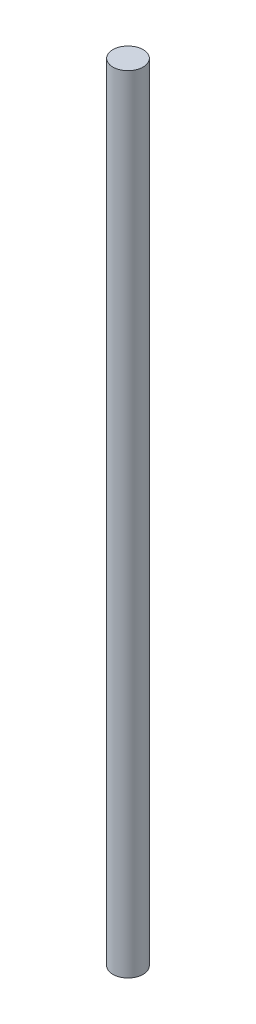
ISO-10303-21;
HEADER;
FILE_DESCRIPTION(('STEP AP214'),'2;1');
FILE_NAME('part.step','',(''),(''),'','','');
FILE_SCHEMA(('AUTOMOTIVE_DESIGN { 1 0 10303 214 1 1 1 1 }'));
ENDSEC;
DATA;
#1=APPLICATION_CONTEXT('core data for automotive mechanical design processes');
#2=APPLICATION_PROTOCOL_DEFINITION('international standard','automotive_design',2000,#1);
#3=PRODUCT_CONTEXT('',#1,'mechanical');
#4=PRODUCT('Part','Part','',(#3));
#5=PRODUCT_RELATED_PRODUCT_CATEGORY('part','',(#4));
#6=PRODUCT_DEFINITION_FORMATION('','',#4);
#7=PRODUCT_DEFINITION_CONTEXT('part definition',#1,'design');
#8=PRODUCT_DEFINITION('design','',#6,#7);
#9=PRODUCT_DEFINITION_SHAPE('','',#8);
#10=(LENGTH_UNIT() NAMED_UNIT(*) SI_UNIT(.MILLI.,.METRE.));
#11=(NAMED_UNIT(*) PLANE_ANGLE_UNIT() SI_UNIT($,.RADIAN.));
#12=(NAMED_UNIT(*) SI_UNIT($,.STERADIAN.) SOLID_ANGLE_UNIT());
#13=UNCERTAINTY_MEASURE_WITH_UNIT(LENGTH_MEASURE(1.E-05),#10,'distance_accuracy_value','');
#14=(GEOMETRIC_REPRESENTATION_CONTEXT(3) GLOBAL_UNCERTAINTY_ASSIGNED_CONTEXT((#13)) GLOBAL_UNIT_ASSIGNED_CONTEXT((#10,
#11,#12)) REPRESENTATION_CONTEXT('',''));
#15=CARTESIAN_POINT('',(0.,0.,0.));
#16=DIRECTION('',(0.,0.,1.));
#17=DIRECTION('',(1.,0.,0.));
#18=AXIS2_PLACEMENT_3D('',#15,#16,#17);
#19=CARTESIAN_POINT('',(0.,66.04,0.));
#20=DIRECTION('',(0.,-1.,0.));
#21=DIRECTION('',(0.,0.,-1.));
#22=AXIS2_PLACEMENT_3D('',#19,#20,#21);
#23=CYLINDRICAL_SURFACE('',#22,1.27);
#24=CARTESIAN_POINT('',(0.,66.04,0.));
#25=DIRECTION('',(0.,1.,0.));
#26=DIRECTION('',(0.,0.,1.));
#27=AXIS2_PLACEMENT_3D('',#24,#25,#26);
#28=CIRCLE('',#27,1.27);
#29=CARTESIAN_POINT('',(0.,66.04,1.27));
#30=VERTEX_POINT('',#29);
#31=EDGE_CURVE('E10',#30,#30,#28,.T.);
#32=ORIENTED_EDGE('',*,*,#31,.F.);
#33=EDGE_LOOP('',(#32));
#34=FACE_BOUND('',#33,.T.);
#35=CARTESIAN_POINT('',(0.,0.,0.));
#36=DIRECTION('',(0.,1.,0.));
#37=DIRECTION('',(0.,0.,1.));
#38=AXIS2_PLACEMENT_3D('',#35,#36,#37);
#39=CIRCLE('',#38,1.27);
#40=CARTESIAN_POINT('',(0.,0.,1.27));
#41=VERTEX_POINT('',#40);
#42=EDGE_CURVE('E36',#41,#41,#39,.T.);
#43=ORIENTED_EDGE('',*,*,#42,.T.);
#44=EDGE_LOOP('',(#43));
#45=FACE_BOUND('',#44,.T.);
#46=ADVANCED_FACE('F33',(#34,#45),#23,.T.);
#47=CARTESIAN_POINT('',(0.,66.04,0.));
#48=DIRECTION('',(0.,1.,0.));
#49=DIRECTION('',(0.,0.,1.));
#50=AXIS2_PLACEMENT_3D('',#47,#48,#49);
#51=PLANE('',#50);
#52=ORIENTED_EDGE('',*,*,#31,.T.);
#53=EDGE_LOOP('',(#52));
#54=FACE_BOUND('',#53,.T.);
#55=ADVANCED_FACE('F48',(#54),#51,.T.);
#56=CARTESIAN_POINT('',(0.,0.,0.));
#57=DIRECTION('',(0.,1.,0.));
#58=DIRECTION('',(0.,0.,1.));
#59=AXIS2_PLACEMENT_3D('',#56,#57,#58);
#60=PLANE('',#59);
#61=ORIENTED_EDGE('',*,*,#42,.F.);
#62=EDGE_LOOP('',(#61));
#63=FACE_BOUND('',#62,.T.);
#64=ADVANCED_FACE('F46',(#63),#60,.F.);
#65=CLOSED_SHELL('',(#46,#55,#64));
#66=MANIFOLD_SOLID_BREP('B2',#65);
#67=ADVANCED_BREP_SHAPE_REPRESENTATION('',(#18,#66),#14);
#68=SHAPE_DEFINITION_REPRESENTATION(#9,#67);
ENDSEC;
END-ISO-10303-21;
